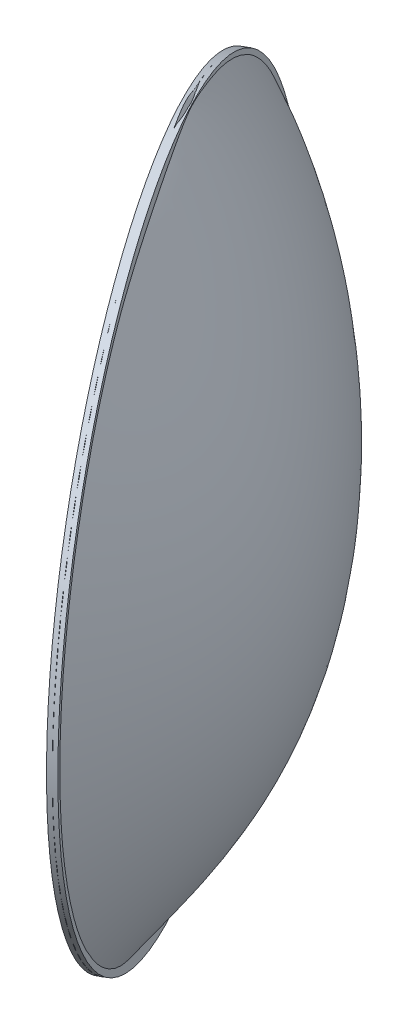
ISO-10303-21;
HEADER;
FILE_DESCRIPTION(('STEP AP214'),'2;1');
FILE_NAME('part.step','',(''),(''),'','','');
FILE_SCHEMA(('AUTOMOTIVE_DESIGN { 1 0 10303 214 1 1 1 1 }'));
ENDSEC;
DATA;
#1=APPLICATION_CONTEXT('core data for automotive mechanical design processes');
#2=APPLICATION_PROTOCOL_DEFINITION('international standard','automotive_design',2000,#1);
#3=PRODUCT_CONTEXT('',#1,'mechanical');
#4=PRODUCT('Part','Part','',(#3));
#5=PRODUCT_RELATED_PRODUCT_CATEGORY('part','',(#4));
#6=PRODUCT_DEFINITION_FORMATION('','',#4);
#7=PRODUCT_DEFINITION_CONTEXT('part definition',#1,'design');
#8=PRODUCT_DEFINITION('design','',#6,#7);
#9=PRODUCT_DEFINITION_SHAPE('','',#8);
#10=(LENGTH_UNIT() NAMED_UNIT(*) SI_UNIT(.MILLI.,.METRE.));
#11=(NAMED_UNIT(*) PLANE_ANGLE_UNIT() SI_UNIT($,.RADIAN.));
#12=(NAMED_UNIT(*) SI_UNIT($,.STERADIAN.) SOLID_ANGLE_UNIT());
#13=UNCERTAINTY_MEASURE_WITH_UNIT(LENGTH_MEASURE(1.E-05),#10,'distance_accuracy_value','');
#14=(GEOMETRIC_REPRESENTATION_CONTEXT(3) GLOBAL_UNCERTAINTY_ASSIGNED_CONTEXT((#13)) GLOBAL_UNIT_ASSIGNED_CONTEXT((#10,
#11,#12)) REPRESENTATION_CONTEXT('',''));
#15=CARTESIAN_POINT('',(0.,0.,0.));
#16=DIRECTION('',(0.,0.,1.));
#17=DIRECTION('',(1.,0.,0.));
#18=AXIS2_PLACEMENT_3D('',#15,#16,#17);
#19=CARTESIAN_POINT('',(5.25092717067204,0.,1.15349631806962));
#20=DIRECTION('',(-0.866025403784438,0.,0.500000000000001));
#21=DIRECTION('',(0.500000000000001,0.,0.866025403784438));
#22=AXIS2_PLACEMENT_3D('',#19,#20,#21);
#23=CYLINDRICAL_SURFACE('',#22,20.);
#24=CARTESIAN_POINT('',(5.25092717067204,0.,1.15349631806962));
#25=DIRECTION('',(0.866025403784438,0.,-0.500000000000001));
#26=DIRECTION('',(-0.500000000000001,0.,-0.866025403784438));
#27=AXIS2_PLACEMENT_3D('',#24,#25,#26);
#28=CIRCLE('',#27,20.);
#29=CARTESIAN_POINT('',(-4.74907282932798,0.,-16.1670117576191));
#30=VERTEX_POINT('',#29);
#31=EDGE_CURVE('E12',#30,#30,#28,.T.);
#32=ORIENTED_EDGE('',*,*,#31,.F.);
#33=EDGE_LOOP('',(#32));
#34=FACE_BOUND('',#33,.T.);
#35=CARTESIAN_POINT('',(4.81791446877983,0.,1.40349631806962));
#36=DIRECTION('',(0.866025403784438,0.,-0.500000000000001));
#37=DIRECTION('',(-0.500000000000001,0.,-0.866025403784438));
#38=AXIS2_PLACEMENT_3D('',#35,#36,#37);
#39=CIRCLE('',#38,20.);
#40=CARTESIAN_POINT('',(-5.18208553122019,0.,-15.9170117576191));
#41=VERTEX_POINT('',#40);
#42=EDGE_CURVE('E79',#41,#41,#39,.T.);
#43=ORIENTED_EDGE('',*,*,#42,.T.);
#44=EDGE_LOOP('',(#43));
#45=FACE_BOUND('',#44,.T.);
#46=ADVANCED_FACE('F76',(#34,#45),#23,.T.);
#47=CARTESIAN_POINT('',(5.25092717067204,0.,1.15349631806962));
#48=DIRECTION('',(0.866025403784438,0.,-0.500000000000001));
#49=DIRECTION('',(-0.500000000000001,0.,-0.866025403784438));
#50=AXIS2_PLACEMENT_3D('',#47,#48,#49);
#51=PLANE('',#50);
#52=ORIENTED_EDGE('',*,*,#31,.T.);
#53=EDGE_LOOP('',(#52));
#54=FACE_BOUND('',#53,.T.);
#55=ADVANCED_FACE('F93',(#54),#51,.T.);
#56=CARTESIAN_POINT('',(4.81791446877983,0.,1.40349631806962));
#57=DIRECTION('',(0.866025403784438,0.,-0.500000000000001));
#58=DIRECTION('',(-0.500000000000001,0.,-0.866025403784438));
#59=AXIS2_PLACEMENT_3D('',#56,#57,#58);
#60=PLANE('',#59);
#61=ORIENTED_EDGE('',*,*,#42,.F.);
#62=EDGE_LOOP('',(#61));
#63=FACE_BOUND('',#62,.T.);
#64=ADVANCED_FACE('F91',(#63),#60,.F.);
#65=CLOSED_SHELL('',(#46,#55,#64));
#66=MANIFOLD_SOLID_BREP('B2',#65);
#67=CARTESIAN_POINT('',(3.3334593782083,19.7052208557678,-1.6786501046294));
#68=CARTESIAN_POINT('',(3.92648337184641,20.0824336924769,-0.6515024175408));
#69=CARTESIAN_POINT('',(4.47116654889706,20.4833472909452,0.291916519138955));
#70=CARTESIAN_POINT('',(8.2600556075205,18.6492930161367,6.85446487291655));
#71=CARTESIAN_POINT('',(9.83381773171944,17.5555098412575,9.58030083105662));
#72=CARTESIAN_POINT('',(2.75914116322412,19.5058842349198,-2.67339843269426));
#73=CARTESIAN_POINT('',(3.86777277061828,19.6402474247538,-1.52470158331639));
#74=CARTESIAN_POINT('',(5.32117222685631,19.6112018920051,0.13852725595299));
#75=CARTESIAN_POINT('',(8.84990503829398,18.0455941319803,7.10460463432626));
#76=CARTESIAN_POINT('',(10.2256127465776,17.1278684125198,10.2589097029432));
#77=CARTESIAN_POINT('',(1.62814616563371,18.9053187490465,-4.63233923162709));
#78=CARTESIAN_POINT('',(3.76799300053995,18.5539826451303,-3.24054405767068));
#79=CARTESIAN_POINT('',(6.91349850299222,17.9275763685965,-0.105368585790819));
#80=CARTESIAN_POINT('',(10.0008002947317,16.7327181315333,7.55499484965529));
#81=CARTESIAN_POINT('',(10.9803991711848,16.1671073229102,11.5662381392261));
#82=CARTESIAN_POINT('',(-0.495848046562217,16.938225827892,-8.31120512213267));
#83=CARTESIAN_POINT('',(3.48421483516183,16.0013880972995,-6.38119241031576));
#84=CARTESIAN_POINT('',(9.78998620806091,14.4770867975046,-0.508586283869499));
#85=CARTESIAN_POINT('',(12.0485307822814,13.947764630951,8.45263794216761));
#86=CARTESIAN_POINT('',(12.3488691891199,13.861435673553,13.9364977389243));
#87=CARTESIAN_POINT('',(-2.76624068805795,13.1418985078322,-12.2436405303338));
#88=CARTESIAN_POINT('',(3.11510778174804,11.9846820743644,-9.66061108857952));
#89=CARTESIAN_POINT('',(12.6644496758384,10.1915528466231,-0.820297110038254));
#90=CARTESIAN_POINT('',(14.1231004330557,10.1108193810058,9.40579147283017));
#91=CARTESIAN_POINT('',(13.7463481325612,10.329872339845,16.3570022714723));
#92=CARTESIAN_POINT('',(-4.54494365231237,6.9940445641671,-15.3244444359958));
#93=CARTESIAN_POINT('',(2.77730073776649,6.24062232921751,-12.1791866625734));
#94=CARTESIAN_POINT('',(14.8103883994236,5.07874930881964,-1.00467292630686));
#95=CARTESIAN_POINT('',(15.6759765095139,5.14824594018295,10.1619751244508));
#96=CARTESIAN_POINT('',(14.8028986214066,5.35578801260261,18.1870013989143));
#97=CARTESIAN_POINT('',(-5.16287882272058,-0.000247334623090279,-16.3947395469265));
#98=CARTESIAN_POINT('',(2.65358483498484,-0.000247334623076333,-13.0466932643531));
#99=CARTESIAN_POINT('',(15.5374710565657,-0.000247334623047483,-1.05780581416116));
#100=CARTESIAN_POINT('',(16.2045410900288,-0.000247334623047475,10.4242514605262));
#101=CARTESIAN_POINT('',(15.1636412517964,-0.00024733462305038,18.8118259632056));
#102=CARTESIAN_POINT('',(-4.54494365231238,-6.99453923341324,-15.3244444359958));
#103=CARTESIAN_POINT('',(2.77730073776648,-6.24111699846364,-12.1791866625734));
#104=CARTESIAN_POINT('',(14.8103883994236,-5.07924397806575,-1.00467292630687));
#105=CARTESIAN_POINT('',(15.6759765095139,-5.14874060942908,10.1619751244509));
#106=CARTESIAN_POINT('',(14.8028986214066,-5.35628268184875,18.1870013989144));
#107=CARTESIAN_POINT('',(-2.76624068805792,-13.1423931770784,-12.2436405303337));
#108=CARTESIAN_POINT('',(3.11510778174807,-11.9851767436105,-9.66061108857951));
#109=CARTESIAN_POINT('',(12.6644496758385,-10.1920475158692,-0.820297110038283));
#110=CARTESIAN_POINT('',(14.1231004330557,-10.1113140502519,9.40579147283014));
#111=CARTESIAN_POINT('',(13.7463481325611,-10.3303670090911,16.3570022714723));
#112=CARTESIAN_POINT('',(-0.495848046562242,-16.9387204971382,-8.31120512213271));
#113=CARTESIAN_POINT('',(3.48421483516182,-16.0018827665457,-6.38119241031579));
#114=CARTESIAN_POINT('',(9.78998620806092,-14.4775814667508,-0.508586283869502));
#115=CARTESIAN_POINT('',(12.0485307822814,-13.9482593001972,8.45263794216764));
#116=CARTESIAN_POINT('',(12.3488691891199,-13.8619303427991,13.9364977389244));
#117=CARTESIAN_POINT('',(1.62814616563372,-18.9058134182927,-4.63233923162707));
#118=CARTESIAN_POINT('',(3.76799300053997,-18.5544773143764,-3.24054405767067));
#119=CARTESIAN_POINT('',(6.91349850299222,-17.9280710378426,-0.105368585790842));
#120=CARTESIAN_POINT('',(10.0008002947317,-16.7332128007794,7.55499484965531));
#121=CARTESIAN_POINT('',(10.9803991711848,-16.1676019921564,11.5662381392261));
#122=CARTESIAN_POINT('',(2.75914116322412,-19.506378904166,-2.67339843269426));
#123=CARTESIAN_POINT('',(3.86777277061828,-19.640742094,-1.5247015833164));
#124=CARTESIAN_POINT('',(5.32117222685633,-19.6116965612512,0.138527255952978));
#125=CARTESIAN_POINT('',(8.849905038294,-18.0460888012264,7.10460463432627));
#126=CARTESIAN_POINT('',(10.2256127465777,-17.1283630817659,10.2589097029433));
#127=CARTESIAN_POINT('',(3.3334593782083,-19.705715525014,-1.6786501046294));
#128=CARTESIAN_POINT('',(3.92648337184642,-20.0829283617231,-0.651502417540805));
#129=CARTESIAN_POINT('',(4.47116654889708,-20.4838419601914,0.291916519138942));
#130=CARTESIAN_POINT('',(8.26005560752052,-18.6497876853829,6.85446487291656));
#131=CARTESIAN_POINT('',(9.83381773171945,-17.5560045105036,9.58030083105664));
#132=B_SPLINE_SURFACE_WITH_KNOTS('',3,3,((#67,#68,#69,#70,#71),(#72,#73,#74,#75,#76),(#77,#78,
#79,#80,#81),(#82,#83,#84,#85,#86),(#87,#88,#89,#90,#91),(#92,#93,#94,#95,#96),(#97,#98,#99,
#100,#101),(#102,#103,#104,#105,#106),(#107,#108,#109,#110,#111),(#112,#113,#114,#115,#116),
(#117,#118,#119,#120,#121),(#122,#123,#124,#125,#126),(#127,#128,#129,#130,#131)),.UNSPECIFIED.,
.F.,.F.,.F.,(4,1,1,1,1,1,1,1,1,1,4),(4,1,4),(0.,0.0625,0.125,0.25,0.375,0.5,0.625,0.75,0.875,
0.9375,1.),(0.,0.442388494157825,1.),.UNSPECIFIED.);
#133=CARTESIAN_POINT('',(3.3334593782083,19.7052208557678,-1.6786501046294));
#134=CARTESIAN_POINT('',(2.75914116322412,19.5058842349198,-2.67339843269426));
#135=CARTESIAN_POINT('',(1.62814616563371,18.9053187490465,-4.63233923162709));
#136=CARTESIAN_POINT('',(-0.495848046562217,16.938225827892,-8.31120512213267));
#137=CARTESIAN_POINT('',(-2.76624068805795,13.1418985078322,-12.2436405303338));
#138=CARTESIAN_POINT('',(-4.54494365231237,6.9940445641671,-15.3244444359958));
#139=CARTESIAN_POINT('',(-5.16287882272058,-0.000247334623090279,-16.3947395469265));
#140=CARTESIAN_POINT('',(-4.54494365231238,-6.99453923341324,-15.3244444359958));
#141=CARTESIAN_POINT('',(-2.76624068805792,-13.1423931770784,-12.2436405303337));
#142=CARTESIAN_POINT('',(-0.495848046562242,-16.9387204971382,-8.31120512213271));
#143=CARTESIAN_POINT('',(1.62814616563372,-18.9058134182927,-4.63233923162707));
#144=CARTESIAN_POINT('',(2.75914116322412,-19.506378904166,-2.67339843269426));
#145=CARTESIAN_POINT('',(3.3334593782083,-19.705715525014,-1.6786501046294));
#146=B_SPLINE_CURVE_WITH_KNOTS('',3,(#133,#134,#135,#136,#137,#138,#139,#140,#141,#142,#143,
#144,#145),.UNSPECIFIED.,.F.,.F.,(4,1,1,1,1,1,1,1,1,1,4),(0.,0.0625,0.125,0.25,0.375,0.5,0.625,
0.75,0.875,0.9375,1.),.UNSPECIFIED.);
#147=CARTESIAN_POINT('',(3.3334593782083,19.7052208557678,-1.6786501046294));
#148=VERTEX_POINT('',#147);
#149=CARTESIAN_POINT('',(3.3334593782083,-19.705715525014,-1.6786501046294));
#150=VERTEX_POINT('',#149);
#151=EDGE_CURVE('E74',#148,#150,#146,.T.);
#152=CARTESIAN_POINT('',(3.3334593782083,-19.705715525014,-1.6786501046294));
#153=CARTESIAN_POINT('',(3.92648337184642,-20.0829283617231,-0.651502417540805));
#154=CARTESIAN_POINT('',(4.47116654889708,-20.4838419601914,0.291916519138942));
#155=CARTESIAN_POINT('',(8.26005560752052,-18.6497876853829,6.85446487291656));
#156=CARTESIAN_POINT('',(9.83381773171945,-17.5560045105036,9.58030083105664));
#157=B_SPLINE_CURVE_WITH_KNOTS('',3,(#152,#153,#154,#155,#156),.UNSPECIFIED.,.F.,.F.,(4,1,4),
(0.,0.442388494157825,1.),.UNSPECIFIED.);
#158=CARTESIAN_POINT('',(9.83381773171945,-17.5560045105036,9.58030083105664));
#159=VERTEX_POINT('',#158);
#160=EDGE_CURVE('E135',#150,#159,#157,.T.);
#161=CARTESIAN_POINT('',(9.83381773171944,17.5555098412575,9.58030083105662));
#162=CARTESIAN_POINT('',(10.2256127465776,17.1278684125198,10.2589097029432));
#163=CARTESIAN_POINT('',(10.9803991711848,16.1671073229102,11.5662381392261));
#164=CARTESIAN_POINT('',(12.3488691891199,13.861435673553,13.9364977389243));
#165=CARTESIAN_POINT('',(13.7463481325612,10.329872339845,16.3570022714723));
#166=CARTESIAN_POINT('',(14.8028986214066,5.35578801260261,18.1870013989143));
#167=CARTESIAN_POINT('',(15.1636412517964,-0.00024733462305038,18.8118259632056));
#168=CARTESIAN_POINT('',(14.8028986214066,-5.35628268184875,18.1870013989144));
#169=CARTESIAN_POINT('',(13.7463481325611,-10.3303670090911,16.3570022714723));
#170=CARTESIAN_POINT('',(12.3488691891199,-13.8619303427991,13.9364977389244));
#171=CARTESIAN_POINT('',(10.9803991711848,-16.1676019921564,11.5662381392261));
#172=CARTESIAN_POINT('',(10.2256127465777,-17.1283630817659,10.2589097029433));
#173=CARTESIAN_POINT('',(9.83381773171945,-17.5560045105036,9.58030083105664));
#174=B_SPLINE_CURVE_WITH_KNOTS('',3,(#161,#162,#163,#164,#165,#166,#167,#168,#169,#170,#171,
#172,#173),.UNSPECIFIED.,.F.,.F.,(4,1,1,1,1,1,1,1,1,1,4),(0.,0.0625,0.125,0.25,0.375,0.5,0.625,
0.75,0.875,0.9375,1.),.UNSPECIFIED.);
#175=CARTESIAN_POINT('',(9.83381773171944,17.5555098412575,9.58030083105662));
#176=VERTEX_POINT('',#175);
#177=EDGE_CURVE('E143',#159,#176,#174,.F.);
#178=CARTESIAN_POINT('',(3.3334593782083,19.7052208557678,-1.6786501046294));
#179=CARTESIAN_POINT('',(3.92648337184641,20.0824336924769,-0.6515024175408));
#180=CARTESIAN_POINT('',(4.47116654889706,20.4833472909452,0.291916519138955));
#181=CARTESIAN_POINT('',(8.2600556075205,18.6492930161367,6.85446487291655));
#182=CARTESIAN_POINT('',(9.83381773171944,17.5555098412575,9.58030083105662));
#183=B_SPLINE_CURVE_WITH_KNOTS('',3,(#178,#179,#180,#181,#182),.UNSPECIFIED.,.F.,.F.,(4,1,4),
(0.,0.442388494157825,1.),.UNSPECIFIED.);
#184=EDGE_CURVE('E127',#176,#148,#183,.F.);
#185=ORIENTED_EDGE('',*,*,#151,.T.);
#186=ORIENTED_EDGE('',*,*,#160,.T.);
#187=ORIENTED_EDGE('',*,*,#177,.T.);
#188=ORIENTED_EDGE('',*,*,#184,.T.);
#189=EDGE_LOOP('',(#185,#186,#187,#188));
#190=FACE_BOUND('',#189,.T.);
#191=ADVANCED_FACE('F124',(#190),#132,.T.);
#192=OPEN_SHELL('',(#191));
#193=SHELL_BASED_SURFACE_MODEL('B7',(#192));
#194=ADVANCED_BREP_SHAPE_REPRESENTATION('',(#18,#66),#14);
#195=MANIFOLD_SURFACE_SHAPE_REPRESENTATION('',(#18,#193),#14);
#196=SHAPE_REPRESENTATION('',(#18),#14);
#197=SHAPE_DEFINITION_REPRESENTATION(#9,#196);
#198=SHAPE_REPRESENTATION_RELATIONSHIP('','',#196,#194);
#199=SHAPE_REPRESENTATION_RELATIONSHIP('','',#196,#195);
ENDSEC;
END-ISO-10303-21;
